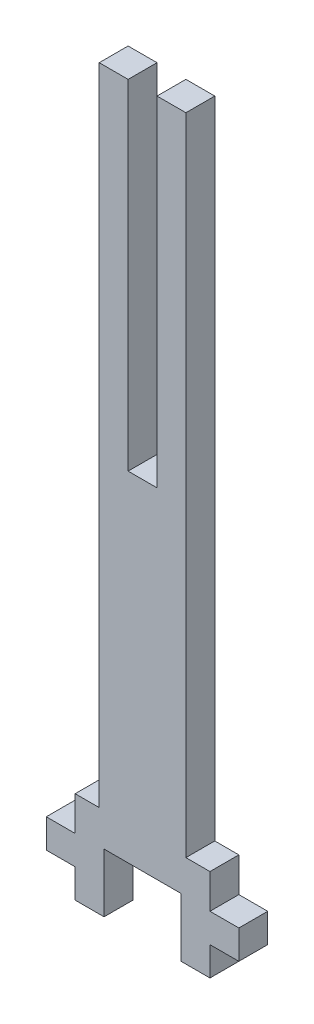
ISO-10303-21;
HEADER;
FILE_DESCRIPTION(('STEP AP214'),'2;1');
FILE_NAME('part.step','',(''),(''),'','','');
FILE_SCHEMA(('AUTOMOTIVE_DESIGN { 1 0 10303 214 1 1 1 1 }'));
ENDSEC;
DATA;
#1=APPLICATION_CONTEXT('core data for automotive mechanical design processes');
#2=APPLICATION_PROTOCOL_DEFINITION('international standard','automotive_design',2000,#1);
#3=PRODUCT_CONTEXT('',#1,'mechanical');
#4=PRODUCT('Part','Part','',(#3));
#5=PRODUCT_RELATED_PRODUCT_CATEGORY('part','',(#4));
#6=PRODUCT_DEFINITION_FORMATION('','',#4);
#7=PRODUCT_DEFINITION_CONTEXT('part definition',#1,'design');
#8=PRODUCT_DEFINITION('design','',#6,#7);
#9=PRODUCT_DEFINITION_SHAPE('','',#8);
#10=(LENGTH_UNIT() NAMED_UNIT(*) SI_UNIT(.MILLI.,.METRE.));
#11=(NAMED_UNIT(*) PLANE_ANGLE_UNIT() SI_UNIT($,.RADIAN.));
#12=(NAMED_UNIT(*) SI_UNIT($,.STERADIAN.) SOLID_ANGLE_UNIT());
#13=UNCERTAINTY_MEASURE_WITH_UNIT(LENGTH_MEASURE(1.E-05),#10,'distance_accuracy_value','');
#14=(GEOMETRIC_REPRESENTATION_CONTEXT(3) GLOBAL_UNCERTAINTY_ASSIGNED_CONTEXT((#13)) GLOBAL_UNIT_ASSIGNED_CONTEXT((#10,
#11,#12)) REPRESENTATION_CONTEXT('',''));
#15=CARTESIAN_POINT('',(0.,0.,0.));
#16=DIRECTION('',(0.,0.,1.));
#17=DIRECTION('',(1.,0.,0.));
#18=AXIS2_PLACEMENT_3D('',#15,#16,#17);
#19=CARTESIAN_POINT('',(7.,0.,3.));
#20=DIRECTION('',(-1.,0.,0.));
#21=DIRECTION('',(0.,0.,1.));
#22=AXIS2_PLACEMENT_3D('',#19,#20,#21);
#23=PLANE('',#22);
#24=DIRECTION('',(0.,0.,1.));
#25=VECTOR('',#24,1.);
#26=CARTESIAN_POINT('',(7.,-32.283500033,0.));
#27=LINE('',#26,#25);
#28=CARTESIAN_POINT('',(7.,-32.283500033,0.));
#29=VERTEX_POINT('',#28);
#30=CARTESIAN_POINT('',(7.,-32.283500033,3.));
#31=VERTEX_POINT('',#30);
#32=EDGE_CURVE('E211',#29,#31,#27,.T.);
#33=ORIENTED_EDGE('',*,*,#32,.F.);
#34=DIRECTION('',(0.,1.,0.));
#35=VECTOR('',#34,1.);
#36=CARTESIAN_POINT('',(7.,0.,0.));
#37=LINE('',#36,#35);
#38=CARTESIAN_POINT('',(7.,-28.708499937,0.));
#39=VERTEX_POINT('',#38);
#40=EDGE_CURVE('E301',#29,#39,#37,.T.);
#41=ORIENTED_EDGE('',*,*,#40,.T.);
#42=DIRECTION('',(0.,0.,-1.));
#43=VECTOR('',#42,1.);
#44=CARTESIAN_POINT('',(7.,-28.708499937,3.));
#45=LINE('',#44,#43);
#46=CARTESIAN_POINT('',(7.,-28.708499937,3.));
#47=VERTEX_POINT('',#46);
#48=EDGE_CURVE('E235',#47,#39,#45,.T.);
#49=ORIENTED_EDGE('',*,*,#48,.F.);
#50=DIRECTION('',(0.,1.,0.));
#51=VECTOR('',#50,1.);
#52=CARTESIAN_POINT('',(7.,0.,3.));
#53=LINE('',#52,#51);
#54=EDGE_CURVE('E227',#31,#47,#53,.T.);
#55=ORIENTED_EDGE('',*,*,#54,.F.);
#56=EDGE_LOOP('',(#33,#41,#49,#55));
#57=FACE_BOUND('',#56,.T.);
#58=ADVANCED_FACE('F50',(#57),#23,.F.);
#59=CARTESIAN_POINT('',(-7.,0.,3.));
#60=DIRECTION('',(1.,0.,0.));
#61=DIRECTION('',(0.,0.,-1.));
#62=AXIS2_PLACEMENT_3D('',#59,#60,#61);
#63=PLANE('',#62);
#64=DIRECTION('',(0.,0.,1.));
#65=VECTOR('',#64,1.);
#66=CARTESIAN_POINT('',(-7.,-35.283500033,0.));
#67=LINE('',#66,#65);
#68=CARTESIAN_POINT('',(-7.,-35.283500033,0.));
#69=VERTEX_POINT('',#68);
#70=CARTESIAN_POINT('',(-7.,-35.283500033,3.));
#71=VERTEX_POINT('',#70);
#72=EDGE_CURVE('E398',#69,#71,#67,.T.);
#73=ORIENTED_EDGE('',*,*,#72,.F.);
#74=DIRECTION('',(0.,-1.,0.));
#75=VECTOR('',#74,1.);
#76=CARTESIAN_POINT('',(-7.,0.,0.));
#77=LINE('',#76,#75);
#78=CARTESIAN_POINT('',(-7.,-38.283500033,0.));
#79=VERTEX_POINT('',#78);
#80=EDGE_CURVE('E279',#69,#79,#77,.T.);
#81=ORIENTED_EDGE('',*,*,#80,.T.);
#82=DIRECTION('',(0.,0.,-1.));
#83=VECTOR('',#82,1.);
#84=CARTESIAN_POINT('',(-7.,-38.283500033,3.));
#85=LINE('',#84,#83);
#86=CARTESIAN_POINT('',(-7.,-38.283500033,3.));
#87=VERTEX_POINT('',#86);
#88=EDGE_CURVE('E341',#87,#79,#85,.T.);
#89=ORIENTED_EDGE('',*,*,#88,.F.);
#90=DIRECTION('',(0.,-1.,0.));
#91=VECTOR('',#90,1.);
#92=CARTESIAN_POINT('',(-7.,0.,3.));
#93=LINE('',#92,#91);
#94=EDGE_CURVE('E431',#71,#87,#93,.T.);
#95=ORIENTED_EDGE('',*,*,#94,.F.);
#96=EDGE_LOOP('',(#73,#81,#89,#95));
#97=FACE_BOUND('',#96,.T.);
#98=ADVANCED_FACE('F574',(#97),#63,.F.);
#99=CARTESIAN_POINT('',(0.,38.283500033,3.));
#100=DIRECTION('',(0.,1.,0.));
#101=DIRECTION('',(0.,0.,1.));
#102=AXIS2_PLACEMENT_3D('',#99,#100,#101);
#103=PLANE('',#102);
#104=DIRECTION('',(0.,0.,1.));
#105=VECTOR('',#104,1.);
#106=CARTESIAN_POINT('',(1.5,38.283500033,-35.3609887386568));
#107=LINE('',#106,#105);
#108=CARTESIAN_POINT('',(1.5,38.283500033,0.));
#109=VERTEX_POINT('',#108);
#110=CARTESIAN_POINT('',(1.5,38.283500033,3.));
#111=VERTEX_POINT('',#110);
#112=EDGE_CURVE('E409',#109,#111,#107,.T.);
#113=ORIENTED_EDGE('',*,*,#112,.T.);
#114=DIRECTION('',(1.,0.,0.));
#115=VECTOR('',#114,1.);
#116=CARTESIAN_POINT('',(0.,38.283500033,3.));
#117=LINE('',#116,#115);
#118=CARTESIAN_POINT('',(4.5,38.283500033,3.));
#119=VERTEX_POINT('',#118);
#120=EDGE_CURVE('E314',#111,#119,#117,.T.);
#121=ORIENTED_EDGE('',*,*,#120,.T.);
#122=DIRECTION('',(0.,0.,-1.));
#123=VECTOR('',#122,1.);
#124=CARTESIAN_POINT('',(4.5,38.283500033,3.));
#125=LINE('',#124,#123);
#126=CARTESIAN_POINT('',(4.5,38.283500033,0.));
#127=VERTEX_POINT('',#126);
#128=EDGE_CURVE('E266',#119,#127,#125,.T.);
#129=ORIENTED_EDGE('',*,*,#128,.T.);
#130=DIRECTION('',(1.,0.,0.));
#131=VECTOR('',#130,1.);
#132=CARTESIAN_POINT('',(0.,38.283500033,0.));
#133=LINE('',#132,#131);
#134=EDGE_CURVE('E272',#109,#127,#133,.T.);
#135=ORIENTED_EDGE('',*,*,#134,.F.);
#136=EDGE_LOOP('',(#113,#121,#129,#135));
#137=FACE_BOUND('',#136,.T.);
#138=ADVANCED_FACE('F544',(#137),#103,.T.);
#139=DIRECTION('',(0.,0.,1.));
#140=VECTOR('',#139,1.);
#141=CARTESIAN_POINT('',(-1.5,38.283500033,-35.3609887386568));
#142=LINE('',#141,#140);
#143=CARTESIAN_POINT('',(-1.5,38.283500033,0.));
#144=VERTEX_POINT('',#143);
#145=CARTESIAN_POINT('',(-1.5,38.283500033,3.));
#146=VERTEX_POINT('',#145);
#147=EDGE_CURVE('E371',#144,#146,#142,.T.);
#148=ORIENTED_EDGE('',*,*,#147,.F.);
#149=CARTESIAN_POINT('',(-4.5,38.283500033,0.));
#150=VERTEX_POINT('',#149);
#151=EDGE_CURVE('E267',#150,#144,#133,.T.);
#152=ORIENTED_EDGE('',*,*,#151,.F.);
#153=DIRECTION('',(0.,0.,-1.));
#154=VECTOR('',#153,1.);
#155=CARTESIAN_POINT('',(-4.5,38.283500033,3.));
#156=LINE('',#155,#154);
#157=CARTESIAN_POINT('',(-4.5,38.283500033,3.));
#158=VERTEX_POINT('',#157);
#159=EDGE_CURVE('E12',#158,#150,#156,.T.);
#160=ORIENTED_EDGE('',*,*,#159,.F.);
#161=EDGE_CURVE('E417',#158,#146,#117,.T.);
#162=ORIENTED_EDGE('',*,*,#161,.T.);
#163=EDGE_LOOP('',(#148,#152,#160,#162));
#164=FACE_BOUND('',#163,.T.);
#165=ADVANCED_FACE('F52',(#164),#103,.T.);
#166=CARTESIAN_POINT('',(-4.5,0.,3.));
#167=DIRECTION('',(-1.,0.,0.));
#168=DIRECTION('',(0.,0.,1.));
#169=AXIS2_PLACEMENT_3D('',#166,#167,#168);
#170=PLANE('',#169);
#171=DIRECTION('',(0.,1.,0.));
#172=VECTOR('',#171,1.);
#173=CARTESIAN_POINT('',(-4.5,0.,0.));
#174=LINE('',#173,#172);
#175=CARTESIAN_POINT('',(-4.5,-28.708499937,0.));
#176=VERTEX_POINT('',#175);
#177=EDGE_CURVE('E271',#176,#150,#174,.T.);
#178=ORIENTED_EDGE('',*,*,#177,.F.);
#179=DIRECTION('',(0.,0.,-1.));
#180=VECTOR('',#179,1.);
#181=CARTESIAN_POINT('',(-4.5,-28.708499937,3.));
#182=LINE('',#181,#180);
#183=CARTESIAN_POINT('',(-4.5,-28.708499937,3.));
#184=VERTEX_POINT('',#183);
#185=EDGE_CURVE('E59',#184,#176,#182,.T.);
#186=ORIENTED_EDGE('',*,*,#185,.F.);
#187=DIRECTION('',(0.,1.,0.));
#188=VECTOR('',#187,1.);
#189=CARTESIAN_POINT('',(-4.5,0.,3.));
#190=LINE('',#189,#188);
#191=EDGE_CURVE('E366',#184,#158,#190,.T.);
#192=ORIENTED_EDGE('',*,*,#191,.T.);
#193=ORIENTED_EDGE('',*,*,#159,.T.);
#194=EDGE_LOOP('',(#178,#186,#192,#193));
#195=FACE_BOUND('',#194,.T.);
#196=ADVANCED_FACE('F364',(#195),#170,.T.);
#197=CARTESIAN_POINT('',(0.,-28.708499937,3.));
#198=DIRECTION('',(0.,-1.,0.));
#199=DIRECTION('',(0.,0.,-1.));
#200=AXIS2_PLACEMENT_3D('',#197,#198,#199);
#201=PLANE('',#200);
#202=DIRECTION('',(-1.,0.,0.));
#203=VECTOR('',#202,1.);
#204=CARTESIAN_POINT('',(0.,-28.708499937,0.));
#205=LINE('',#204,#203);
#206=CARTESIAN_POINT('',(-7.,-28.708499937,0.));
#207=VERTEX_POINT('',#206);
#208=EDGE_CURVE('E276',#176,#207,#205,.T.);
#209=ORIENTED_EDGE('',*,*,#208,.T.);
#210=DIRECTION('',(0.,0.,-1.));
#211=VECTOR('',#210,1.);
#212=CARTESIAN_POINT('',(-7.,-28.708499937,3.));
#213=LINE('',#212,#211);
#214=CARTESIAN_POINT('',(-7.,-28.708499937,3.));
#215=VERTEX_POINT('',#214);
#216=EDGE_CURVE('E345',#215,#207,#213,.T.);
#217=ORIENTED_EDGE('',*,*,#216,.F.);
#218=DIRECTION('',(-1.,0.,0.));
#219=VECTOR('',#218,1.);
#220=CARTESIAN_POINT('',(0.,-28.708499937,3.));
#221=LINE('',#220,#219);
#222=EDGE_CURVE('E354',#184,#215,#221,.T.);
#223=ORIENTED_EDGE('',*,*,#222,.F.);
#224=ORIENTED_EDGE('',*,*,#185,.T.);
#225=EDGE_LOOP('',(#209,#217,#223,#224));
#226=FACE_BOUND('',#225,.T.);
#227=ADVANCED_FACE('F352',(#226),#201,.F.);
#228=CARTESIAN_POINT('',(-7.,-32.283500033,0.));
#229=VERTEX_POINT('',#228);
#230=EDGE_CURVE('E280',#207,#229,#77,.T.);
#231=ORIENTED_EDGE('',*,*,#230,.T.);
#232=DIRECTION('',(0.,0.,1.));
#233=VECTOR('',#232,1.);
#234=CARTESIAN_POINT('',(-7.,-32.283500033,0.));
#235=LINE('',#234,#233);
#236=CARTESIAN_POINT('',(-7.,-32.283500033,3.));
#237=VERTEX_POINT('',#236);
#238=EDGE_CURVE('E388',#229,#237,#235,.T.);
#239=ORIENTED_EDGE('',*,*,#238,.T.);
#240=EDGE_CURVE('E432',#215,#237,#93,.T.);
#241=ORIENTED_EDGE('',*,*,#240,.F.);
#242=ORIENTED_EDGE('',*,*,#216,.T.);
#243=EDGE_LOOP('',(#231,#239,#241,#242));
#244=FACE_BOUND('',#243,.T.);
#245=ADVANCED_FACE('F531',(#244),#63,.F.);
#246=CARTESIAN_POINT('',(0.,-38.283500033,3.));
#247=DIRECTION('',(0.,1.,0.));
#248=DIRECTION('',(0.,0.,1.));
#249=AXIS2_PLACEMENT_3D('',#246,#247,#248);
#250=PLANE('',#249);
#251=DIRECTION('',(1.,0.,0.));
#252=VECTOR('',#251,1.);
#253=CARTESIAN_POINT('',(0.,-38.283500033,0.));
#254=LINE('',#253,#252);
#255=CARTESIAN_POINT('',(-4.,-38.283500033,0.));
#256=VERTEX_POINT('',#255);
#257=EDGE_CURVE('E284',#79,#256,#254,.T.);
#258=ORIENTED_EDGE('',*,*,#257,.T.);
#259=DIRECTION('',(0.,0.,-1.));
#260=VECTOR('',#259,1.);
#261=CARTESIAN_POINT('',(-4.,-38.283500033,3.));
#262=LINE('',#261,#260);
#263=CARTESIAN_POINT('',(-4.,-38.283500033,3.));
#264=VERTEX_POINT('',#263);
#265=EDGE_CURVE('E337',#264,#256,#262,.T.);
#266=ORIENTED_EDGE('',*,*,#265,.F.);
#267=DIRECTION('',(1.,0.,0.));
#268=VECTOR('',#267,1.);
#269=CARTESIAN_POINT('',(0.,-38.283500033,3.));
#270=LINE('',#269,#268);
#271=EDGE_CURVE('E437',#87,#264,#270,.T.);
#272=ORIENTED_EDGE('',*,*,#271,.F.);
#273=ORIENTED_EDGE('',*,*,#88,.T.);
#274=EDGE_LOOP('',(#258,#266,#272,#273));
#275=FACE_BOUND('',#274,.T.);
#276=ADVANCED_FACE('F598',(#275),#250,.F.);
#277=CARTESIAN_POINT('',(-4.,0.,3.));
#278=DIRECTION('',(-1.,0.,0.));
#279=DIRECTION('',(0.,0.,1.));
#280=AXIS2_PLACEMENT_3D('',#277,#278,#279);
#281=PLANE('',#280);
#282=DIRECTION('',(0.,1.,0.));
#283=VECTOR('',#282,1.);
#284=CARTESIAN_POINT('',(-4.,0.,0.));
#285=LINE('',#284,#283);
#286=CARTESIAN_POINT('',(-4.,-32.183500033,0.));
#287=VERTEX_POINT('',#286);
#288=EDGE_CURVE('E287',#256,#287,#285,.T.);
#289=ORIENTED_EDGE('',*,*,#288,.T.);
#290=DIRECTION('',(0.,0.,-1.));
#291=VECTOR('',#290,1.);
#292=CARTESIAN_POINT('',(-4.,-32.183500033,3.));
#293=LINE('',#292,#291);
#294=CARTESIAN_POINT('',(-4.,-32.183500033,3.));
#295=VERTEX_POINT('',#294);
#296=EDGE_CURVE('E333',#295,#287,#293,.T.);
#297=ORIENTED_EDGE('',*,*,#296,.F.);
#298=DIRECTION('',(0.,1.,0.));
#299=VECTOR('',#298,1.);
#300=CARTESIAN_POINT('',(-4.,0.,3.));
#301=LINE('',#300,#299);
#302=EDGE_CURVE('E450',#264,#295,#301,.T.);
#303=ORIENTED_EDGE('',*,*,#302,.F.);
#304=ORIENTED_EDGE('',*,*,#265,.T.);
#305=EDGE_LOOP('',(#289,#297,#303,#304));
#306=FACE_BOUND('',#305,.T.);
#307=ADVANCED_FACE('F595',(#306),#281,.F.);
#308=CARTESIAN_POINT('',(0.,-32.183500033,3.));
#309=DIRECTION('',(0.,1.,0.));
#310=DIRECTION('',(0.,0.,1.));
#311=AXIS2_PLACEMENT_3D('',#308,#309,#310);
#312=PLANE('',#311);
#313=DIRECTION('',(1.,0.,0.));
#314=VECTOR('',#313,1.);
#315=CARTESIAN_POINT('',(0.,-32.183500033,0.));
#316=LINE('',#315,#314);
#317=CARTESIAN_POINT('',(4.,-32.183500033,0.));
#318=VERTEX_POINT('',#317);
#319=EDGE_CURVE('E290',#287,#318,#316,.T.);
#320=ORIENTED_EDGE('',*,*,#319,.T.);
#321=DIRECTION('',(0.,0.,-1.));
#322=VECTOR('',#321,1.);
#323=CARTESIAN_POINT('',(4.,-32.183500033,3.));
#324=LINE('',#323,#322);
#325=CARTESIAN_POINT('',(4.,-32.183500033,3.));
#326=VERTEX_POINT('',#325);
#327=EDGE_CURVE('E330',#326,#318,#324,.T.);
#328=ORIENTED_EDGE('',*,*,#327,.F.);
#329=DIRECTION('',(1.,0.,0.));
#330=VECTOR('',#329,1.);
#331=CARTESIAN_POINT('',(0.,-32.183500033,3.));
#332=LINE('',#331,#330);
#333=EDGE_CURVE('E453',#295,#326,#332,.T.);
#334=ORIENTED_EDGE('',*,*,#333,.F.);
#335=ORIENTED_EDGE('',*,*,#296,.T.);
#336=EDGE_LOOP('',(#320,#328,#334,#335));
#337=FACE_BOUND('',#336,.T.);
#338=ADVANCED_FACE('F470',(#337),#312,.F.);
#339=CARTESIAN_POINT('',(4.,0.,3.));
#340=DIRECTION('',(-1.,0.,0.));
#341=DIRECTION('',(0.,0.,1.));
#342=AXIS2_PLACEMENT_3D('',#339,#340,#341);
#343=PLANE('',#342);
#344=DIRECTION('',(0.,1.,0.));
#345=VECTOR('',#344,1.);
#346=CARTESIAN_POINT('',(4.,0.,0.));
#347=LINE('',#346,#345);
#348=CARTESIAN_POINT('',(4.,-38.283500033,0.));
#349=VERTEX_POINT('',#348);
#350=EDGE_CURVE('E294',#349,#318,#347,.T.);
#351=ORIENTED_EDGE('',*,*,#350,.F.);
#352=DIRECTION('',(0.,0.,-1.));
#353=VECTOR('',#352,1.);
#354=CARTESIAN_POINT('',(4.,-38.283500033,3.));
#355=LINE('',#354,#353);
#356=CARTESIAN_POINT('',(4.,-38.283500033,3.));
#357=VERTEX_POINT('',#356);
#358=EDGE_CURVE('E327',#357,#349,#355,.T.);
#359=ORIENTED_EDGE('',*,*,#358,.F.);
#360=DIRECTION('',(0.,1.,0.));
#361=VECTOR('',#360,1.);
#362=CARTESIAN_POINT('',(4.,0.,3.));
#363=LINE('',#362,#361);
#364=EDGE_CURVE('E245',#357,#326,#363,.T.);
#365=ORIENTED_EDGE('',*,*,#364,.T.);
#366=ORIENTED_EDGE('',*,*,#327,.T.);
#367=EDGE_LOOP('',(#351,#359,#365,#366));
#368=FACE_BOUND('',#367,.T.);
#369=ADVANCED_FACE('F462',(#368),#343,.T.);
#370=CARTESIAN_POINT('',(0.,-38.283500033,3.));
#371=DIRECTION('',(0.,1.,0.));
#372=DIRECTION('',(0.,0.,1.));
#373=AXIS2_PLACEMENT_3D('',#370,#371,#372);
#374=PLANE('',#373);
#375=DIRECTION('',(1.,0.,0.));
#376=VECTOR('',#375,1.);
#377=CARTESIAN_POINT('',(0.,-38.283500033,0.));
#378=LINE('',#377,#376);
#379=CARTESIAN_POINT('',(7.,-38.283500033,0.));
#380=VERTEX_POINT('',#379);
#381=EDGE_CURVE('E298',#349,#380,#378,.T.);
#382=ORIENTED_EDGE('',*,*,#381,.T.);
#383=DIRECTION('',(0.,0.,-1.));
#384=VECTOR('',#383,1.);
#385=CARTESIAN_POINT('',(7.,-38.283500033,3.));
#386=LINE('',#385,#384);
#387=CARTESIAN_POINT('',(7.,-38.283500033,3.));
#388=VERTEX_POINT('',#387);
#389=EDGE_CURVE('E323',#388,#380,#386,.T.);
#390=ORIENTED_EDGE('',*,*,#389,.F.);
#391=DIRECTION('',(1.,0.,0.));
#392=VECTOR('',#391,1.);
#393=CARTESIAN_POINT('',(0.,-38.283500033,3.));
#394=LINE('',#393,#392);
#395=EDGE_CURVE('E239',#357,#388,#394,.T.);
#396=ORIENTED_EDGE('',*,*,#395,.F.);
#397=ORIENTED_EDGE('',*,*,#358,.T.);
#398=EDGE_LOOP('',(#382,#390,#396,#397));
#399=FACE_BOUND('',#398,.T.);
#400=ADVANCED_FACE('F477',(#399),#374,.F.);
#401=CARTESIAN_POINT('',(7.,-35.283500033,0.));
#402=VERTEX_POINT('',#401);
#403=EDGE_CURVE('E302',#380,#402,#37,.T.);
#404=ORIENTED_EDGE('',*,*,#403,.T.);
#405=DIRECTION('',(0.,0.,1.));
#406=VECTOR('',#405,1.);
#407=CARTESIAN_POINT('',(7.,-35.283500033,0.));
#408=LINE('',#407,#406);
#409=CARTESIAN_POINT('',(7.,-35.283500033,3.));
#410=VERTEX_POINT('',#409);
#411=EDGE_CURVE('E481',#402,#410,#408,.T.);
#412=ORIENTED_EDGE('',*,*,#411,.T.);
#413=EDGE_CURVE('E238',#388,#410,#53,.T.);
#414=ORIENTED_EDGE('',*,*,#413,.F.);
#415=ORIENTED_EDGE('',*,*,#389,.T.);
#416=EDGE_LOOP('',(#404,#412,#414,#415));
#417=FACE_BOUND('',#416,.T.);
#418=ADVANCED_FACE('F480',(#417),#23,.F.);
#419=CARTESIAN_POINT('',(0.,-28.708499937,3.));
#420=DIRECTION('',(0.,-1.,0.));
#421=DIRECTION('',(0.,0.,-1.));
#422=AXIS2_PLACEMENT_3D('',#419,#420,#421);
#423=PLANE('',#422);
#424=DIRECTION('',(-1.,0.,0.));
#425=VECTOR('',#424,1.);
#426=CARTESIAN_POINT('',(0.,-28.708499937,0.));
#427=LINE('',#426,#425);
#428=CARTESIAN_POINT('',(4.5,-28.708499937,0.));
#429=VERTEX_POINT('',#428);
#430=EDGE_CURVE('E306',#39,#429,#427,.T.);
#431=ORIENTED_EDGE('',*,*,#430,.T.);
#432=DIRECTION('',(0.,0.,-1.));
#433=VECTOR('',#432,1.);
#434=CARTESIAN_POINT('',(4.5,-28.708499937,3.));
#435=LINE('',#434,#433);
#436=CARTESIAN_POINT('',(4.5,-28.708499937,3.));
#437=VERTEX_POINT('',#436);
#438=EDGE_CURVE('E318',#437,#429,#435,.T.);
#439=ORIENTED_EDGE('',*,*,#438,.F.);
#440=DIRECTION('',(-1.,0.,0.));
#441=VECTOR('',#440,1.);
#442=CARTESIAN_POINT('',(0.,-28.708499937,3.));
#443=LINE('',#442,#441);
#444=EDGE_CURVE('E244',#47,#437,#443,.T.);
#445=ORIENTED_EDGE('',*,*,#444,.F.);
#446=ORIENTED_EDGE('',*,*,#48,.T.);
#447=EDGE_LOOP('',(#431,#439,#445,#446));
#448=FACE_BOUND('',#447,.T.);
#449=ADVANCED_FACE('F551',(#448),#423,.F.);
#450=CARTESIAN_POINT('',(4.5,0.,3.));
#451=DIRECTION('',(1.,0.,0.));
#452=DIRECTION('',(0.,0.,-1.));
#453=AXIS2_PLACEMENT_3D('',#450,#451,#452);
#454=PLANE('',#453);
#455=DIRECTION('',(0.,-1.,0.));
#456=VECTOR('',#455,1.);
#457=CARTESIAN_POINT('',(4.5,0.,0.));
#458=LINE('',#457,#456);
#459=EDGE_CURVE('E310',#127,#429,#458,.T.);
#460=ORIENTED_EDGE('',*,*,#459,.F.);
#461=ORIENTED_EDGE('',*,*,#128,.F.);
#462=DIRECTION('',(0.,-1.,0.));
#463=VECTOR('',#462,1.);
#464=CARTESIAN_POINT('',(4.5,0.,3.));
#465=LINE('',#464,#463);
#466=EDGE_CURVE('E261',#119,#437,#465,.T.);
#467=ORIENTED_EDGE('',*,*,#466,.T.);
#468=ORIENTED_EDGE('',*,*,#438,.T.);
#469=EDGE_LOOP('',(#460,#461,#467,#468));
#470=FACE_BOUND('',#469,.T.);
#471=ADVANCED_FACE('F548',(#470),#454,.T.);
#472=CARTESIAN_POINT('',(0.,0.,3.));
#473=DIRECTION('',(0.,0.,1.));
#474=DIRECTION('',(1.,0.,0.));
#475=AXIS2_PLACEMENT_3D('',#472,#473,#474);
#476=PLANE('',#475);
#477=DIRECTION('',(0.,1.,0.));
#478=VECTOR('',#477,1.);
#479=CARTESIAN_POINT('',(1.5,38.283500033,3.));
#480=LINE('',#479,#478);
#481=CARTESIAN_POINT('',(1.5,3.05,3.));
#482=VERTEX_POINT('',#481);
#483=EDGE_CURVE('E393',#482,#111,#480,.T.);
#484=ORIENTED_EDGE('',*,*,#483,.F.);
#485=DIRECTION('',(1.,0.,0.));
#486=VECTOR('',#485,1.);
#487=CARTESIAN_POINT('',(-1.5,3.05,3.));
#488=LINE('',#487,#486);
#489=CARTESIAN_POINT('',(-1.5,3.05,3.));
#490=VERTEX_POINT('',#489);
#491=EDGE_CURVE('E405',#490,#482,#488,.T.);
#492=ORIENTED_EDGE('',*,*,#491,.F.);
#493=DIRECTION('',(0.,-1.,0.));
#494=VECTOR('',#493,1.);
#495=CARTESIAN_POINT('',(-1.5,38.283500033,3.));
#496=LINE('',#495,#494);
#497=EDGE_CURVE('E397',#146,#490,#496,.T.);
#498=ORIENTED_EDGE('',*,*,#497,.F.);
#499=ORIENTED_EDGE('',*,*,#161,.F.);
#500=ORIENTED_EDGE('',*,*,#191,.F.);
#501=ORIENTED_EDGE('',*,*,#222,.T.);
#502=ORIENTED_EDGE('',*,*,#240,.T.);
#503=DIRECTION('',(-1.,0.,0.));
#504=VECTOR('',#503,1.);
#505=CARTESIAN_POINT('',(-7.,-32.283500033,3.));
#506=LINE('',#505,#504);
#507=CARTESIAN_POINT('',(-10.,-32.283500033,3.));
#508=VERTEX_POINT('',#507);
#509=EDGE_CURVE('E74',#237,#508,#506,.T.);
#510=ORIENTED_EDGE('',*,*,#509,.T.);
#511=DIRECTION('',(0.,-1.,0.));
#512=VECTOR('',#511,1.);
#513=CARTESIAN_POINT('',(-10.,-35.283500033,3.));
#514=LINE('',#513,#512);
#515=CARTESIAN_POINT('',(-10.,-35.283500033,3.));
#516=VERTEX_POINT('',#515);
#517=EDGE_CURVE('E486',#508,#516,#514,.T.);
#518=ORIENTED_EDGE('',*,*,#517,.T.);
#519=DIRECTION('',(1.,0.,0.));
#520=VECTOR('',#519,1.);
#521=CARTESIAN_POINT('',(-7.,-35.283500033,3.));
#522=LINE('',#521,#520);
#523=EDGE_CURVE('E506',#516,#71,#522,.T.);
#524=ORIENTED_EDGE('',*,*,#523,.T.);
#525=ORIENTED_EDGE('',*,*,#94,.T.);
#526=ORIENTED_EDGE('',*,*,#271,.T.);
#527=ORIENTED_EDGE('',*,*,#302,.T.);
#528=ORIENTED_EDGE('',*,*,#333,.T.);
#529=ORIENTED_EDGE('',*,*,#364,.F.);
#530=ORIENTED_EDGE('',*,*,#395,.T.);
#531=ORIENTED_EDGE('',*,*,#413,.T.);
#532=DIRECTION('',(1.,0.,0.));
#533=VECTOR('',#532,1.);
#534=CARTESIAN_POINT('',(7.,-35.283500033,3.));
#535=LINE('',#534,#533);
#536=CARTESIAN_POINT('',(10.,-35.283500033,3.));
#537=VERTEX_POINT('',#536);
#538=EDGE_CURVE('E66',#410,#537,#535,.T.);
#539=ORIENTED_EDGE('',*,*,#538,.T.);
#540=DIRECTION('',(0.,1.,0.));
#541=VECTOR('',#540,1.);
#542=CARTESIAN_POINT('',(10.,-35.283500033,3.));
#543=LINE('',#542,#541);
#544=CARTESIAN_POINT('',(10.,-32.283500033,3.));
#545=VERTEX_POINT('',#544);
#546=EDGE_CURVE('E230',#537,#545,#543,.T.);
#547=ORIENTED_EDGE('',*,*,#546,.T.);
#548=DIRECTION('',(-1.,0.,0.));
#549=VECTOR('',#548,1.);
#550=CARTESIAN_POINT('',(7.,-32.283500033,3.));
#551=LINE('',#550,#549);
#552=EDGE_CURVE('E214',#545,#31,#551,.T.);
#553=ORIENTED_EDGE('',*,*,#552,.T.);
#554=ORIENTED_EDGE('',*,*,#54,.T.);
#555=ORIENTED_EDGE('',*,*,#444,.T.);
#556=ORIENTED_EDGE('',*,*,#466,.F.);
#557=ORIENTED_EDGE('',*,*,#120,.F.);
#558=EDGE_LOOP('',(#484,#492,#498,#499,#500,#501,#502,#510,#518,#524,#525,#526,#527,#528,#529,
#530,#531,#539,#547,#553,#554,#555,#556,#557));
#559=FACE_BOUND('',#558,.T.);
#560=ADVANCED_FACE('F226',(#559),#476,.T.);
#561=CARTESIAN_POINT('',(0.,0.,0.));
#562=DIRECTION('',(0.,0.,1.));
#563=DIRECTION('',(1.,0.,0.));
#564=AXIS2_PLACEMENT_3D('',#561,#562,#563);
#565=PLANE('',#564);
#566=DIRECTION('',(-1.,0.,0.));
#567=VECTOR('',#566,1.);
#568=CARTESIAN_POINT('',(-1.5,3.05,0.));
#569=LINE('',#568,#567);
#570=CARTESIAN_POINT('',(1.5,3.05,0.));
#571=VERTEX_POINT('',#570);
#572=CARTESIAN_POINT('',(-1.5,3.05,0.));
#573=VERTEX_POINT('',#572);
#574=EDGE_CURVE('E376',#571,#573,#569,.T.);
#575=ORIENTED_EDGE('',*,*,#574,.F.);
#576=DIRECTION('',(0.,-1.,0.));
#577=VECTOR('',#576,1.);
#578=CARTESIAN_POINT('',(1.5,38.283500033,0.));
#579=LINE('',#578,#577);
#580=EDGE_CURVE('E383',#109,#571,#579,.T.);
#581=ORIENTED_EDGE('',*,*,#580,.F.);
#582=ORIENTED_EDGE('',*,*,#134,.T.);
#583=ORIENTED_EDGE('',*,*,#459,.T.);
#584=ORIENTED_EDGE('',*,*,#430,.F.);
#585=ORIENTED_EDGE('',*,*,#40,.F.);
#586=DIRECTION('',(-1.,0.,0.));
#587=VECTOR('',#586,1.);
#588=CARTESIAN_POINT('',(7.,-32.283500033,0.));
#589=LINE('',#588,#587);
#590=CARTESIAN_POINT('',(10.,-32.283500033,0.));
#591=VERTEX_POINT('',#590);
#592=EDGE_CURVE('E216',#591,#29,#589,.T.);
#593=ORIENTED_EDGE('',*,*,#592,.F.);
#594=DIRECTION('',(0.,1.,0.));
#595=VECTOR('',#594,1.);
#596=CARTESIAN_POINT('',(10.,-35.283500033,0.));
#597=LINE('',#596,#595);
#598=CARTESIAN_POINT('',(10.,-35.283500033,0.));
#599=VERTEX_POINT('',#598);
#600=EDGE_CURVE('E494',#599,#591,#597,.T.);
#601=ORIENTED_EDGE('',*,*,#600,.F.);
#602=DIRECTION('',(1.,0.,0.));
#603=VECTOR('',#602,1.);
#604=CARTESIAN_POINT('',(7.,-35.283500033,0.));
#605=LINE('',#604,#603);
#606=EDGE_CURVE('E232',#402,#599,#605,.T.);
#607=ORIENTED_EDGE('',*,*,#606,.F.);
#608=ORIENTED_EDGE('',*,*,#403,.F.);
#609=ORIENTED_EDGE('',*,*,#381,.F.);
#610=ORIENTED_EDGE('',*,*,#350,.T.);
#611=ORIENTED_EDGE('',*,*,#319,.F.);
#612=ORIENTED_EDGE('',*,*,#288,.F.);
#613=ORIENTED_EDGE('',*,*,#257,.F.);
#614=ORIENTED_EDGE('',*,*,#80,.F.);
#615=DIRECTION('',(1.,0.,0.));
#616=VECTOR('',#615,1.);
#617=CARTESIAN_POINT('',(-7.,-35.283500033,0.));
#618=LINE('',#617,#616);
#619=CARTESIAN_POINT('',(-10.,-35.283500033,0.));
#620=VERTEX_POINT('',#619);
#621=EDGE_CURVE('E510',#620,#69,#618,.T.);
#622=ORIENTED_EDGE('',*,*,#621,.F.);
#623=DIRECTION('',(0.,-1.,0.));
#624=VECTOR('',#623,1.);
#625=CARTESIAN_POINT('',(-10.,-35.283500033,0.));
#626=LINE('',#625,#624);
#627=CARTESIAN_POINT('',(-10.,-32.283500033,0.));
#628=VERTEX_POINT('',#627);
#629=EDGE_CURVE('E505',#628,#620,#626,.T.);
#630=ORIENTED_EDGE('',*,*,#629,.F.);
#631=DIRECTION('',(-1.,0.,0.));
#632=VECTOR('',#631,1.);
#633=CARTESIAN_POINT('',(-7.,-32.283500033,0.));
#634=LINE('',#633,#632);
#635=EDGE_CURVE('E501',#229,#628,#634,.T.);
#636=ORIENTED_EDGE('',*,*,#635,.F.);
#637=ORIENTED_EDGE('',*,*,#230,.F.);
#638=ORIENTED_EDGE('',*,*,#208,.F.);
#639=ORIENTED_EDGE('',*,*,#177,.T.);
#640=ORIENTED_EDGE('',*,*,#151,.T.);
#641=DIRECTION('',(0.,1.,0.));
#642=VECTOR('',#641,1.);
#643=CARTESIAN_POINT('',(-1.5,38.283500033,0.));
#644=LINE('',#643,#642);
#645=EDGE_CURVE('E373',#573,#144,#644,.T.);
#646=ORIENTED_EDGE('',*,*,#645,.F.);
#647=EDGE_LOOP('',(#575,#581,#582,#583,#584,#585,#593,#601,#607,#608,#609,#610,#611,#612,#613,
#614,#622,#630,#636,#637,#638,#639,#640,#646));
#648=FACE_BOUND('',#647,.T.);
#649=ADVANCED_FACE('F362',(#648),#565,.F.);
#650=CARTESIAN_POINT('',(1.5,38.283500033,-35.3609887386568));
#651=DIRECTION('',(1.,0.,0.));
#652=DIRECTION('',(0.,1.,0.));
#653=AXIS2_PLACEMENT_3D('',#650,#651,#652);
#654=PLANE('',#653);
#655=ORIENTED_EDGE('',*,*,#580,.T.);
#656=DIRECTION('',(0.,0.,1.));
#657=VECTOR('',#656,1.);
#658=CARTESIAN_POINT('',(1.5,3.05,-35.3609887386568));
#659=LINE('',#658,#657);
#660=EDGE_CURVE('E379',#571,#482,#659,.T.);
#661=ORIENTED_EDGE('',*,*,#660,.T.);
#662=ORIENTED_EDGE('',*,*,#483,.T.);
#663=ORIENTED_EDGE('',*,*,#112,.F.);
#664=EDGE_LOOP('',(#655,#661,#662,#663));
#665=FACE_BOUND('',#664,.T.);
#666=ADVANCED_FACE('F652',(#665),#654,.F.);
#667=CARTESIAN_POINT('',(-1.5,3.05,-35.3609887386568));
#668=DIRECTION('',(0.,-1.,0.));
#669=DIRECTION('',(1.,0.,0.));
#670=AXIS2_PLACEMENT_3D('',#667,#668,#669);
#671=PLANE('',#670);
#672=ORIENTED_EDGE('',*,*,#574,.T.);
#673=DIRECTION('',(0.,0.,1.));
#674=VECTOR('',#673,1.);
#675=CARTESIAN_POINT('',(-1.5,3.05,-35.3609887386568));
#676=LINE('',#675,#674);
#677=EDGE_CURVE('E385',#573,#490,#676,.T.);
#678=ORIENTED_EDGE('',*,*,#677,.T.);
#679=ORIENTED_EDGE('',*,*,#491,.T.);
#680=ORIENTED_EDGE('',*,*,#660,.F.);
#681=EDGE_LOOP('',(#672,#678,#679,#680));
#682=FACE_BOUND('',#681,.T.);
#683=ADVANCED_FACE('F639',(#682),#671,.F.);
#684=CARTESIAN_POINT('',(-1.5,38.283500033,-35.3609887386568));
#685=DIRECTION('',(-1.,0.,0.));
#686=DIRECTION('',(0.,-1.,0.));
#687=AXIS2_PLACEMENT_3D('',#684,#685,#686);
#688=PLANE('',#687);
#689=ORIENTED_EDGE('',*,*,#645,.T.);
#690=ORIENTED_EDGE('',*,*,#147,.T.);
#691=ORIENTED_EDGE('',*,*,#497,.T.);
#692=ORIENTED_EDGE('',*,*,#677,.F.);
#693=EDGE_LOOP('',(#689,#690,#691,#692));
#694=FACE_BOUND('',#693,.T.);
#695=ADVANCED_FACE('F632',(#694),#688,.F.);
#696=CARTESIAN_POINT('',(-7.,-35.283500033,0.));
#697=DIRECTION('',(0.,-1.,0.));
#698=DIRECTION('',(0.,0.,-1.));
#699=AXIS2_PLACEMENT_3D('',#696,#697,#698);
#700=PLANE('',#699);
#701=ORIENTED_EDGE('',*,*,#523,.F.);
#702=DIRECTION('',(0.,0.,1.));
#703=VECTOR('',#702,1.);
#704=CARTESIAN_POINT('',(-10.,-35.283500033,0.));
#705=LINE('',#704,#703);
#706=EDGE_CURVE('E523',#620,#516,#705,.T.);
#707=ORIENTED_EDGE('',*,*,#706,.F.);
#708=ORIENTED_EDGE('',*,*,#621,.T.);
#709=ORIENTED_EDGE('',*,*,#72,.T.);
#710=EDGE_LOOP('',(#701,#707,#708,#709));
#711=FACE_BOUND('',#710,.T.);
#712=ADVANCED_FACE('F638',(#711),#700,.T.);
#713=CARTESIAN_POINT('',(-10.,-35.283500033,0.));
#714=DIRECTION('',(-1.,0.,0.));
#715=DIRECTION('',(0.,-1.,0.));
#716=AXIS2_PLACEMENT_3D('',#713,#714,#715);
#717=PLANE('',#716);
#718=ORIENTED_EDGE('',*,*,#517,.F.);
#719=DIRECTION('',(0.,0.,1.));
#720=VECTOR('',#719,1.);
#721=CARTESIAN_POINT('',(-10.,-32.283500033,0.));
#722=LINE('',#721,#720);
#723=EDGE_CURVE('E525',#628,#508,#722,.T.);
#724=ORIENTED_EDGE('',*,*,#723,.F.);
#725=ORIENTED_EDGE('',*,*,#629,.T.);
#726=ORIENTED_EDGE('',*,*,#706,.T.);
#727=EDGE_LOOP('',(#718,#724,#725,#726));
#728=FACE_BOUND('',#727,.T.);
#729=ADVANCED_FACE('F816',(#728),#717,.T.);
#730=CARTESIAN_POINT('',(-7.,-32.283500033,0.));
#731=DIRECTION('',(0.,1.,0.));
#732=DIRECTION('',(0.,0.,1.));
#733=AXIS2_PLACEMENT_3D('',#730,#731,#732);
#734=PLANE('',#733);
#735=ORIENTED_EDGE('',*,*,#509,.F.);
#736=ORIENTED_EDGE('',*,*,#238,.F.);
#737=ORIENTED_EDGE('',*,*,#635,.T.);
#738=ORIENTED_EDGE('',*,*,#723,.T.);
#739=EDGE_LOOP('',(#735,#736,#737,#738));
#740=FACE_BOUND('',#739,.T.);
#741=ADVANCED_FACE('F571',(#740),#734,.T.);
#742=CARTESIAN_POINT('',(7.,-32.283500033,0.));
#743=DIRECTION('',(0.,1.,0.));
#744=DIRECTION('',(0.,0.,1.));
#745=AXIS2_PLACEMENT_3D('',#742,#743,#744);
#746=PLANE('',#745);
#747=ORIENTED_EDGE('',*,*,#552,.F.);
#748=DIRECTION('',(0.,0.,1.));
#749=VECTOR('',#748,1.);
#750=CARTESIAN_POINT('',(10.,-32.283500033,0.));
#751=LINE('',#750,#749);
#752=EDGE_CURVE('E221',#591,#545,#751,.T.);
#753=ORIENTED_EDGE('',*,*,#752,.F.);
#754=ORIENTED_EDGE('',*,*,#592,.T.);
#755=ORIENTED_EDGE('',*,*,#32,.T.);
#756=EDGE_LOOP('',(#747,#753,#754,#755));
#757=FACE_BOUND('',#756,.T.);
#758=ADVANCED_FACE('F213',(#757),#746,.T.);
#759=CARTESIAN_POINT('',(10.,-35.283500033,0.));
#760=DIRECTION('',(1.,0.,0.));
#761=DIRECTION('',(0.,0.,-1.));
#762=AXIS2_PLACEMENT_3D('',#759,#760,#761);
#763=PLANE('',#762);
#764=ORIENTED_EDGE('',*,*,#546,.F.);
#765=DIRECTION('',(0.,0.,1.));
#766=VECTOR('',#765,1.);
#767=CARTESIAN_POINT('',(10.,-35.283500033,0.));
#768=LINE('',#767,#766);
#769=EDGE_CURVE('E555',#599,#537,#768,.T.);
#770=ORIENTED_EDGE('',*,*,#769,.F.);
#771=ORIENTED_EDGE('',*,*,#600,.T.);
#772=ORIENTED_EDGE('',*,*,#752,.T.);
#773=EDGE_LOOP('',(#764,#770,#771,#772));
#774=FACE_BOUND('',#773,.T.);
#775=ADVANCED_FACE('F563',(#774),#763,.T.);
#776=CARTESIAN_POINT('',(7.,-35.283500033,0.));
#777=DIRECTION('',(0.,-1.,0.));
#778=DIRECTION('',(0.,0.,-1.));
#779=AXIS2_PLACEMENT_3D('',#776,#777,#778);
#780=PLANE('',#779);
#781=ORIENTED_EDGE('',*,*,#538,.F.);
#782=ORIENTED_EDGE('',*,*,#411,.F.);
#783=ORIENTED_EDGE('',*,*,#606,.T.);
#784=ORIENTED_EDGE('',*,*,#769,.T.);
#785=EDGE_LOOP('',(#781,#782,#783,#784));
#786=FACE_BOUND('',#785,.T.);
#787=ADVANCED_FACE('F554',(#786),#780,.T.);
#788=CLOSED_SHELL('',(#58,#98,#138,#165,#196,#227,#245,#276,#307,#338,#369,#400,#418,#449,#471,
#560,#649,#666,#683,#695,#712,#729,#741,#758,#775,#787));
#789=MANIFOLD_SOLID_BREP('B2',#788);
#790=ADVANCED_BREP_SHAPE_REPRESENTATION('',(#18,#789),#14);
#791=SHAPE_DEFINITION_REPRESENTATION(#9,#790);
ENDSEC;
END-ISO-10303-21;
